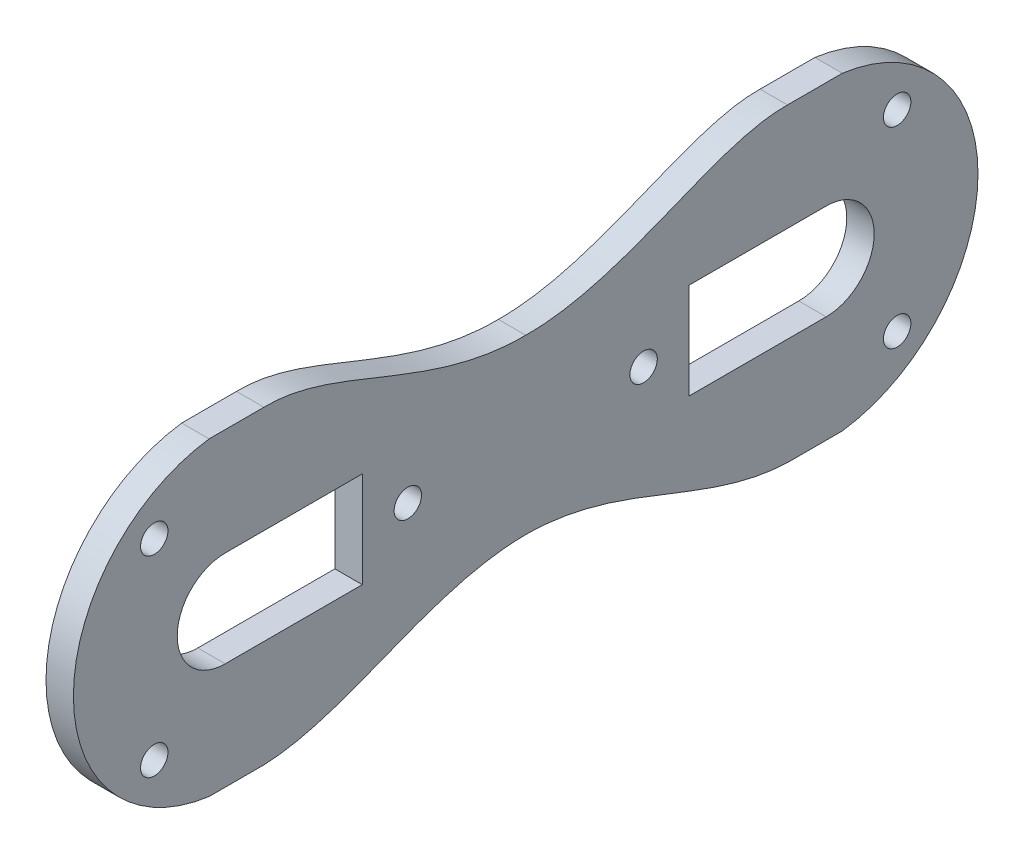
ISO-10303-21;
HEADER;
FILE_DESCRIPTION(('STEP AP214'),'2;1');
FILE_NAME('part.step','',(''),(''),'','','');
FILE_SCHEMA(('AUTOMOTIVE_DESIGN { 1 0 10303 214 1 1 1 1 }'));
ENDSEC;
DATA;
#1=APPLICATION_CONTEXT('core data for automotive mechanical design processes');
#2=APPLICATION_PROTOCOL_DEFINITION('international standard','automotive_design',2000,#1);
#3=PRODUCT_CONTEXT('',#1,'mechanical');
#4=PRODUCT('Part','Part','',(#3));
#5=PRODUCT_RELATED_PRODUCT_CATEGORY('part','',(#4));
#6=PRODUCT_DEFINITION_FORMATION('','',#4);
#7=PRODUCT_DEFINITION_CONTEXT('part definition',#1,'design');
#8=PRODUCT_DEFINITION('design','',#6,#7);
#9=PRODUCT_DEFINITION_SHAPE('','',#8);
#10=(LENGTH_UNIT() NAMED_UNIT(*) SI_UNIT(.MILLI.,.METRE.));
#11=(NAMED_UNIT(*) PLANE_ANGLE_UNIT() SI_UNIT($,.RADIAN.));
#12=(NAMED_UNIT(*) SI_UNIT($,.STERADIAN.) SOLID_ANGLE_UNIT());
#13=UNCERTAINTY_MEASURE_WITH_UNIT(LENGTH_MEASURE(1.E-05),#10,'distance_accuracy_value','');
#14=(GEOMETRIC_REPRESENTATION_CONTEXT(3) GLOBAL_UNCERTAINTY_ASSIGNED_CONTEXT((#13)) GLOBAL_UNIT_ASSIGNED_CONTEXT((#10,
#11,#12)) REPRESENTATION_CONTEXT('',''));
#15=CARTESIAN_POINT('',(0.,0.,0.));
#16=DIRECTION('',(0.,0.,1.));
#17=DIRECTION('',(1.,0.,0.));
#18=AXIS2_PLACEMENT_3D('',#15,#16,#17);
#19=CARTESIAN_POINT('',(2.,-3.5,0.));
#20=DIRECTION('',(0.,1.,0.));
#21=DIRECTION('',(0.,0.,1.));
#22=AXIS2_PLACEMENT_3D('',#19,#20,#21);
#23=PLANE('',#22);
#24=DIRECTION('',(0.,0.,-1.));
#25=VECTOR('',#24,1.);
#26=CARTESIAN_POINT('',(0.,-3.5,0.));
#27=LINE('',#26,#25);
#28=CARTESIAN_POINT('',(0.,-3.5,9.6760101010101));
#29=VERTEX_POINT('',#28);
#30=CARTESIAN_POINT('',(0.,-3.5,-0.323989898989895));
#31=VERTEX_POINT('',#30);
#32=EDGE_CURVE('E277',#29,#31,#27,.T.);
#33=ORIENTED_EDGE('',*,*,#32,.F.);
#34=DIRECTION('',(-1.,0.,0.));
#35=VECTOR('',#34,1.);
#36=CARTESIAN_POINT('',(2.,-3.5,9.6760101010101));
#37=LINE('',#36,#35);
#38=CARTESIAN_POINT('',(2.,-3.5,9.6760101010101));
#39=VERTEX_POINT('',#38);
#40=EDGE_CURVE('E11',#39,#29,#37,.T.);
#41=ORIENTED_EDGE('',*,*,#40,.F.);
#42=DIRECTION('',(0.,0.,-1.));
#43=VECTOR('',#42,1.);
#44=CARTESIAN_POINT('',(2.,-3.5,0.));
#45=LINE('',#44,#43);
#46=CARTESIAN_POINT('',(2.,-3.5,-0.323989898989895));
#47=VERTEX_POINT('',#46);
#48=EDGE_CURVE('E189',#39,#47,#45,.T.);
#49=ORIENTED_EDGE('',*,*,#48,.T.);
#50=DIRECTION('',(-1.,0.,0.));
#51=VECTOR('',#50,1.);
#52=CARTESIAN_POINT('',(2.,-3.5,-0.323989898989895));
#53=LINE('',#52,#51);
#54=EDGE_CURVE('E119',#47,#31,#53,.T.);
#55=ORIENTED_EDGE('',*,*,#54,.T.);
#56=EDGE_LOOP('',(#33,#41,#49,#55));
#57=FACE_BOUND('',#56,.T.);
#58=ADVANCED_FACE('F35',(#57),#23,.T.);
#59=CARTESIAN_POINT('',(2.,0.,9.6760101010101));
#60=DIRECTION('',(0.,0.,-1.));
#61=DIRECTION('',(-1.,0.,0.));
#62=AXIS2_PLACEMENT_3D('',#59,#60,#61);
#63=PLANE('',#62);
#64=DIRECTION('',(0.,-1.,0.));
#65=VECTOR('',#64,1.);
#66=CARTESIAN_POINT('',(0.,0.,9.6760101010101));
#67=LINE('',#66,#65);
#68=CARTESIAN_POINT('',(0.,3.5,9.6760101010101));
#69=VERTEX_POINT('',#68);
#70=EDGE_CURVE('E178',#69,#29,#67,.T.);
#71=ORIENTED_EDGE('',*,*,#70,.F.);
#72=DIRECTION('',(-1.,0.,0.));
#73=VECTOR('',#72,1.);
#74=CARTESIAN_POINT('',(2.,3.5,9.6760101010101));
#75=LINE('',#74,#73);
#76=CARTESIAN_POINT('',(2.,3.5,9.6760101010101));
#77=VERTEX_POINT('',#76);
#78=EDGE_CURVE('E45',#77,#69,#75,.T.);
#79=ORIENTED_EDGE('',*,*,#78,.F.);
#80=DIRECTION('',(0.,-1.,0.));
#81=VECTOR('',#80,1.);
#82=CARTESIAN_POINT('',(2.,0.,9.6760101010101));
#83=LINE('',#82,#81);
#84=EDGE_CURVE('E176',#77,#39,#83,.T.);
#85=ORIENTED_EDGE('',*,*,#84,.T.);
#86=ORIENTED_EDGE('',*,*,#40,.T.);
#87=EDGE_LOOP('',(#71,#79,#85,#86));
#88=FACE_BOUND('',#87,.T.);
#89=ADVANCED_FACE('F174',(#88),#63,.T.);
#90=CARTESIAN_POINT('',(2.,3.5,0.));
#91=DIRECTION('',(0.,1.,0.));
#92=DIRECTION('',(0.,0.,1.));
#93=AXIS2_PLACEMENT_3D('',#90,#91,#92);
#94=PLANE('',#93);
#95=DIRECTION('',(0.,0.,-1.));
#96=VECTOR('',#95,1.);
#97=CARTESIAN_POINT('',(0.,3.5,0.));
#98=LINE('',#97,#96);
#99=CARTESIAN_POINT('',(0.,3.5,-0.323989898989895));
#100=VERTEX_POINT('',#99);
#101=EDGE_CURVE('E280',#69,#100,#98,.T.);
#102=ORIENTED_EDGE('',*,*,#101,.T.);
#103=DIRECTION('',(-1.,0.,0.));
#104=VECTOR('',#103,1.);
#105=CARTESIAN_POINT('',(2.,3.5,-0.323989898989895));
#106=LINE('',#105,#104);
#107=CARTESIAN_POINT('',(2.,3.5,-0.323989898989895));
#108=VERTEX_POINT('',#107);
#109=EDGE_CURVE('E181',#108,#100,#106,.T.);
#110=ORIENTED_EDGE('',*,*,#109,.F.);
#111=DIRECTION('',(0.,0.,-1.));
#112=VECTOR('',#111,1.);
#113=CARTESIAN_POINT('',(2.,3.5,0.));
#114=LINE('',#113,#112);
#115=EDGE_CURVE('E184',#77,#108,#114,.T.);
#116=ORIENTED_EDGE('',*,*,#115,.F.);
#117=ORIENTED_EDGE('',*,*,#78,.T.);
#118=EDGE_LOOP('',(#102,#110,#116,#117));
#119=FACE_BOUND('',#118,.T.);
#120=ADVANCED_FACE('F185',(#119),#94,.F.);
#121=CARTESIAN_POINT('',(2.,3.5,0.));
#122=DIRECTION('',(0.,-1.,0.));
#123=DIRECTION('',(0.,0.,-1.));
#124=AXIS2_PLACEMENT_3D('',#121,#122,#123);
#125=PLANE('',#124);
#126=DIRECTION('',(0.,0.,1.));
#127=VECTOR('',#126,1.);
#128=CARTESIAN_POINT('',(0.,3.5,0.));
#129=LINE('',#128,#127);
#130=CARTESIAN_POINT('',(0.,3.5,33.5260101010101));
#131=VERTEX_POINT('',#130);
#132=CARTESIAN_POINT('',(0.,3.5,43.5260101010101));
#133=VERTEX_POINT('',#132);
#134=EDGE_CURVE('E256',#131,#133,#129,.T.);
#135=ORIENTED_EDGE('',*,*,#134,.F.);
#136=DIRECTION('',(-1.,0.,0.));
#137=VECTOR('',#136,1.);
#138=CARTESIAN_POINT('',(2.,3.5,33.5260101010101));
#139=LINE('',#138,#137);
#140=CARTESIAN_POINT('',(2.,3.5,33.5260101010101));
#141=VERTEX_POINT('',#140);
#142=EDGE_CURVE('E291',#141,#131,#139,.T.);
#143=ORIENTED_EDGE('',*,*,#142,.F.);
#144=DIRECTION('',(0.,0.,1.));
#145=VECTOR('',#144,1.);
#146=CARTESIAN_POINT('',(2.,3.5,0.));
#147=LINE('',#146,#145);
#148=CARTESIAN_POINT('',(2.,3.5,43.5260101010101));
#149=VERTEX_POINT('',#148);
#150=EDGE_CURVE('E446',#141,#149,#147,.T.);
#151=ORIENTED_EDGE('',*,*,#150,.T.);
#152=DIRECTION('',(-1.,0.,0.));
#153=VECTOR('',#152,1.);
#154=CARTESIAN_POINT('',(2.,3.5,43.5260101010101));
#155=LINE('',#154,#153);
#156=EDGE_CURVE('E293',#149,#133,#155,.T.);
#157=ORIENTED_EDGE('',*,*,#156,.T.);
#158=EDGE_LOOP('',(#135,#143,#151,#157));
#159=FACE_BOUND('',#158,.T.);
#160=ADVANCED_FACE('F409',(#159),#125,.T.);
#161=CARTESIAN_POINT('',(2.,0.,33.5260101010101));
#162=DIRECTION('',(0.,0.,-1.));
#163=DIRECTION('',(-1.,0.,0.));
#164=AXIS2_PLACEMENT_3D('',#161,#162,#163);
#165=PLANE('',#164);
#166=DIRECTION('',(0.,-1.,0.));
#167=VECTOR('',#166,1.);
#168=CARTESIAN_POINT('',(0.,0.,33.5260101010101));
#169=LINE('',#168,#167);
#170=CARTESIAN_POINT('',(0.,-3.5,33.5260101010101));
#171=VERTEX_POINT('',#170);
#172=EDGE_CURVE('E259',#131,#171,#169,.T.);
#173=ORIENTED_EDGE('',*,*,#172,.T.);
#174=DIRECTION('',(-1.,0.,0.));
#175=VECTOR('',#174,1.);
#176=CARTESIAN_POINT('',(2.,-3.5,33.5260101010101));
#177=LINE('',#176,#175);
#178=CARTESIAN_POINT('',(2.,-3.5,33.5260101010101));
#179=VERTEX_POINT('',#178);
#180=EDGE_CURVE('E297',#179,#171,#177,.T.);
#181=ORIENTED_EDGE('',*,*,#180,.F.);
#182=DIRECTION('',(0.,-1.,0.));
#183=VECTOR('',#182,1.);
#184=CARTESIAN_POINT('',(2.,0.,33.5260101010101));
#185=LINE('',#184,#183);
#186=EDGE_CURVE('E449',#141,#179,#185,.T.);
#187=ORIENTED_EDGE('',*,*,#186,.F.);
#188=ORIENTED_EDGE('',*,*,#142,.T.);
#189=EDGE_LOOP('',(#173,#181,#187,#188));
#190=FACE_BOUND('',#189,.T.);
#191=ADVANCED_FACE('F405',(#190),#165,.F.);
#192=CARTESIAN_POINT('',(2.,-3.5,0.));
#193=DIRECTION('',(0.,-1.,0.));
#194=DIRECTION('',(0.,0.,-1.));
#195=AXIS2_PLACEMENT_3D('',#192,#193,#194);
#196=PLANE('',#195);
#197=DIRECTION('',(0.,0.,1.));
#198=VECTOR('',#197,1.);
#199=CARTESIAN_POINT('',(0.,-3.5,0.));
#200=LINE('',#199,#198);
#201=CARTESIAN_POINT('',(0.,-3.5,43.5260101010101));
#202=VERTEX_POINT('',#201);
#203=EDGE_CURVE('E262',#171,#202,#200,.T.);
#204=ORIENTED_EDGE('',*,*,#203,.T.);
#205=DIRECTION('',(-1.,0.,0.));
#206=VECTOR('',#205,1.);
#207=CARTESIAN_POINT('',(2.,-3.5,43.5260101010101));
#208=LINE('',#207,#206);
#209=CARTESIAN_POINT('',(2.,-3.5,43.5260101010101));
#210=VERTEX_POINT('',#209);
#211=EDGE_CURVE('E295',#210,#202,#208,.T.);
#212=ORIENTED_EDGE('',*,*,#211,.F.);
#213=DIRECTION('',(0.,0.,1.));
#214=VECTOR('',#213,1.);
#215=CARTESIAN_POINT('',(2.,-3.5,0.));
#216=LINE('',#215,#214);
#217=EDGE_CURVE('E452',#179,#210,#216,.T.);
#218=ORIENTED_EDGE('',*,*,#217,.F.);
#219=ORIENTED_EDGE('',*,*,#180,.T.);
#220=EDGE_LOOP('',(#204,#212,#218,#219));
#221=FACE_BOUND('',#220,.T.);
#222=ADVANCED_FACE('F402',(#221),#196,.F.);
#223=CARTESIAN_POINT('',(2.,11.3,0.));
#224=DIRECTION('',(0.,-1.,0.));
#225=DIRECTION('',(0.,0.,-1.));
#226=AXIS2_PLACEMENT_3D('',#223,#224,#225);
#227=PLANE('',#226);
#228=DIRECTION('',(0.,0.,1.));
#229=VECTOR('',#228,1.);
#230=CARTESIAN_POINT('',(0.,11.3,0.));
#231=LINE('',#230,#229);
#232=CARTESIAN_POINT('',(0.,11.3,-1.49898989898991));
#233=VERTEX_POINT('',#232);
#234=CARTESIAN_POINT('',(0.,11.3,2.50101010101009));
#235=VERTEX_POINT('',#234);
#236=EDGE_CURVE('E203',#233,#235,#231,.T.);
#237=ORIENTED_EDGE('',*,*,#236,.T.);
#238=DIRECTION('',(-1.,0.,0.));
#239=VECTOR('',#238,1.);
#240=CARTESIAN_POINT('',(2.,11.3,2.50101010101009));
#241=LINE('',#240,#239);
#242=CARTESIAN_POINT('',(2.,11.3,2.50101010101009));
#243=VERTEX_POINT('',#242);
#244=EDGE_CURVE('E39',#243,#235,#241,.T.);
#245=ORIENTED_EDGE('',*,*,#244,.F.);
#246=DIRECTION('',(0.,0.,1.));
#247=VECTOR('',#246,1.);
#248=CARTESIAN_POINT('',(2.,11.3,0.));
#249=LINE('',#248,#247);
#250=CARTESIAN_POINT('',(2.,11.3,-1.49898989898991));
#251=VERTEX_POINT('',#250);
#252=EDGE_CURVE('E289',#251,#243,#249,.T.);
#253=ORIENTED_EDGE('',*,*,#252,.F.);
#254=DIRECTION('',(-1.,0.,0.));
#255=VECTOR('',#254,1.);
#256=CARTESIAN_POINT('',(2.,11.3,-1.49898989898991));
#257=LINE('',#256,#255);
#258=EDGE_CURVE('E202',#251,#233,#257,.T.);
#259=ORIENTED_EDGE('',*,*,#258,.T.);
#260=EDGE_LOOP('',(#237,#245,#253,#259));
#261=FACE_BOUND('',#260,.T.);
#262=ADVANCED_FACE('F37',(#261),#227,.F.);
#263=CARTESIAN_POINT('',(2.,11.3,2.50101010101009));
#264=CARTESIAN_POINT('',(2.,11.4296100531924,7.83989895120709));
#265=CARTESIAN_POINT('',(2.,6.2166526259407,14.3517891795841));
#266=CARTESIAN_POINT('',(2.,6.3,21.6010101010101));
#267=B_SPLINE_CURVE_WITH_KNOTS('',3,(#263,#264,#265,#266),.UNSPECIFIED.,.F.,.F.,(4,4),(0.,1.),.UNSPECIFIED.);
#268=DIRECTION('',(-1.,0.,0.));
#269=VECTOR('',#268,1.);
#270=SURFACE_OF_LINEAR_EXTRUSION('',#267,#269);
#271=CARTESIAN_POINT('',(0.,11.3,2.50101010101009));
#272=CARTESIAN_POINT('',(0.,11.4296100531924,7.83989895120709));
#273=CARTESIAN_POINT('',(0.,6.2166526259407,14.3517891795841));
#274=CARTESIAN_POINT('',(0.,6.3,21.6010101010101));
#275=B_SPLINE_CURVE_WITH_KNOTS('',3,(#271,#272,#273,#274),.UNSPECIFIED.,.F.,.F.,(4,4),(0.,1.),.UNSPECIFIED.);
#276=CARTESIAN_POINT('',(0.,6.3,21.6010101010101));
#277=VERTEX_POINT('',#276);
#278=EDGE_CURVE('E206',#235,#277,#275,.T.);
#279=ORIENTED_EDGE('',*,*,#278,.T.);
#280=DIRECTION('',(-1.,0.,0.));
#281=VECTOR('',#280,1.);
#282=CARTESIAN_POINT('',(2.,6.3,21.6010101010101));
#283=LINE('',#282,#281);
#284=CARTESIAN_POINT('',(2.,6.3,21.6010101010101));
#285=VERTEX_POINT('',#284);
#286=EDGE_CURVE('E315',#285,#277,#283,.T.);
#287=ORIENTED_EDGE('',*,*,#286,.F.);
#288=EDGE_CURVE('E127',#243,#285,#267,.T.);
#289=ORIENTED_EDGE('',*,*,#288,.F.);
#290=ORIENTED_EDGE('',*,*,#244,.T.);
#291=EDGE_LOOP('',(#279,#287,#289,#290));
#292=FACE_BOUND('',#291,.T.);
#293=ADVANCED_FACE('F320',(#292),#270,.F.);
#294=CARTESIAN_POINT('',(2.,11.3,40.7010101010101));
#295=CARTESIAN_POINT('',(2.,11.4296100531924,35.3621212508131));
#296=CARTESIAN_POINT('',(2.,6.2166526259407,28.8502310224361));
#297=CARTESIAN_POINT('',(2.,6.3,21.6010101010101));
#298=B_SPLINE_CURVE_WITH_KNOTS('',3,(#294,#295,#296,#297),.UNSPECIFIED.,.F.,.F.,(4,4),(0.,1.),.UNSPECIFIED.);
#299=DIRECTION('',(-1.,0.,0.));
#300=VECTOR('',#299,1.);
#301=SURFACE_OF_LINEAR_EXTRUSION('',#298,#300);
#302=CARTESIAN_POINT('',(0.,11.3,40.7010101010101));
#303=CARTESIAN_POINT('',(0.,11.4296100531924,35.3621212508131));
#304=CARTESIAN_POINT('',(0.,6.2166526259407,28.8502310224361));
#305=CARTESIAN_POINT('',(0.,6.3,21.6010101010101));
#306=B_SPLINE_CURVE_WITH_KNOTS('',3,(#302,#303,#304,#305),.UNSPECIFIED.,.F.,.F.,(4,4),(0.,1.),.UNSPECIFIED.);
#307=CARTESIAN_POINT('',(0.,11.3,40.7010101010101));
#308=VERTEX_POINT('',#307);
#309=EDGE_CURVE('E211',#308,#277,#306,.T.);
#310=ORIENTED_EDGE('',*,*,#309,.F.);
#311=DIRECTION('',(-1.,0.,0.));
#312=VECTOR('',#311,1.);
#313=CARTESIAN_POINT('',(2.,11.3,40.7010101010101));
#314=LINE('',#313,#312);
#315=CARTESIAN_POINT('',(2.,11.3,40.7010101010101));
#316=VERTEX_POINT('',#315);
#317=EDGE_CURVE('E314',#316,#308,#314,.T.);
#318=ORIENTED_EDGE('',*,*,#317,.F.);
#319=EDGE_CURVE('E728',#316,#285,#298,.T.);
#320=ORIENTED_EDGE('',*,*,#319,.T.);
#321=ORIENTED_EDGE('',*,*,#286,.T.);
#322=EDGE_LOOP('',(#310,#318,#320,#321));
#323=FACE_BOUND('',#322,.T.);
#324=ADVANCED_FACE('F367',(#323),#301,.T.);
#325=CARTESIAN_POINT('',(2.,11.3,0.));
#326=DIRECTION('',(0.,1.,0.));
#327=DIRECTION('',(0.,0.,1.));
#328=AXIS2_PLACEMENT_3D('',#325,#326,#327);
#329=PLANE('',#328);
#330=DIRECTION('',(0.,0.,-1.));
#331=VECTOR('',#330,1.);
#332=CARTESIAN_POINT('',(0.,11.3,0.));
#333=LINE('',#332,#331);
#334=CARTESIAN_POINT('',(0.,11.3,44.7010101010101));
#335=VERTEX_POINT('',#334);
#336=EDGE_CURVE('E219',#335,#308,#333,.T.);
#337=ORIENTED_EDGE('',*,*,#336,.F.);
#338=DIRECTION('',(-1.,0.,0.));
#339=VECTOR('',#338,1.);
#340=CARTESIAN_POINT('',(2.,11.3,44.7010101010101));
#341=LINE('',#340,#339);
#342=CARTESIAN_POINT('',(2.,11.3,44.7010101010101));
#343=VERTEX_POINT('',#342);
#344=EDGE_CURVE('E312',#343,#335,#341,.T.);
#345=ORIENTED_EDGE('',*,*,#344,.F.);
#346=DIRECTION('',(0.,0.,-1.));
#347=VECTOR('',#346,1.);
#348=CARTESIAN_POINT('',(2.,11.3,0.));
#349=LINE('',#348,#347);
#350=EDGE_CURVE('E365',#343,#316,#349,.T.);
#351=ORIENTED_EDGE('',*,*,#350,.T.);
#352=ORIENTED_EDGE('',*,*,#317,.T.);
#353=EDGE_LOOP('',(#337,#345,#351,#352));
#354=FACE_BOUND('',#353,.T.);
#355=ADVANCED_FACE('F362',(#354),#329,.T.);
#356=CARTESIAN_POINT('',(2.,0.,43.2020202020202));
#357=DIRECTION('',(-1.,0.,0.));
#358=DIRECTION('',(0.,0.,1.));
#359=AXIS2_PLACEMENT_3D('',#356,#357,#358);
#360=CYLINDRICAL_SURFACE('',#359,11.3989898989899);
#361=CARTESIAN_POINT('',(0.,0.,43.2020202020202));
#362=DIRECTION('',(1.,0.,0.));
#363=DIRECTION('',(0.,0.,-1.));
#364=AXIS2_PLACEMENT_3D('',#361,#362,#363);
#365=CIRCLE('',#364,11.3989898989899);
#366=CARTESIAN_POINT('',(0.,-11.3,44.7010101010101));
#367=VERTEX_POINT('',#366);
#368=EDGE_CURVE('E225',#335,#367,#365,.T.);
#369=ORIENTED_EDGE('',*,*,#368,.T.);
#370=DIRECTION('',(-1.,0.,0.));
#371=VECTOR('',#370,1.);
#372=CARTESIAN_POINT('',(2.,-11.3,44.7010101010101));
#373=LINE('',#372,#371);
#374=CARTESIAN_POINT('',(2.,-11.3,44.7010101010101));
#375=VERTEX_POINT('',#374);
#376=EDGE_CURVE('E310',#375,#367,#373,.T.);
#377=ORIENTED_EDGE('',*,*,#376,.F.);
#378=CARTESIAN_POINT('',(2.,0.,43.2020202020202));
#379=DIRECTION('',(1.,0.,0.));
#380=DIRECTION('',(0.,0.,-1.));
#381=AXIS2_PLACEMENT_3D('',#378,#379,#380);
#382=CIRCLE('',#381,11.3989898989899);
#383=EDGE_CURVE('E744',#343,#375,#382,.T.);
#384=ORIENTED_EDGE('',*,*,#383,.F.);
#385=ORIENTED_EDGE('',*,*,#344,.T.);
#386=EDGE_LOOP('',(#369,#377,#384,#385));
#387=FACE_BOUND('',#386,.T.);
#388=ADVANCED_FACE('F359',(#387),#360,.T.);
#389=CARTESIAN_POINT('',(2.,-11.3,0.));
#390=DIRECTION('',(0.,-1.,0.));
#391=DIRECTION('',(0.,0.,-1.));
#392=AXIS2_PLACEMENT_3D('',#389,#390,#391);
#393=PLANE('',#392);
#394=DIRECTION('',(0.,0.,1.));
#395=VECTOR('',#394,1.);
#396=CARTESIAN_POINT('',(0.,-11.3,0.));
#397=LINE('',#396,#395);
#398=CARTESIAN_POINT('',(0.,-11.3,40.7010101010101));
#399=VERTEX_POINT('',#398);
#400=EDGE_CURVE('E228',#399,#367,#397,.T.);
#401=ORIENTED_EDGE('',*,*,#400,.F.);
#402=DIRECTION('',(-1.,0.,0.));
#403=VECTOR('',#402,1.);
#404=CARTESIAN_POINT('',(2.,-11.3,40.7010101010101));
#405=LINE('',#404,#403);
#406=CARTESIAN_POINT('',(2.,-11.3,40.7010101010101));
#407=VERTEX_POINT('',#406);
#408=EDGE_CURVE('E308',#407,#399,#405,.T.);
#409=ORIENTED_EDGE('',*,*,#408,.F.);
#410=DIRECTION('',(0.,0.,1.));
#411=VECTOR('',#410,1.);
#412=CARTESIAN_POINT('',(2.,-11.3,0.));
#413=LINE('',#412,#411);
#414=EDGE_CURVE('E356',#407,#375,#413,.T.);
#415=ORIENTED_EDGE('',*,*,#414,.T.);
#416=ORIENTED_EDGE('',*,*,#376,.T.);
#417=EDGE_LOOP('',(#401,#409,#415,#416));
#418=FACE_BOUND('',#417,.T.);
#419=ADVANCED_FACE('F352',(#418),#393,.T.);
#420=CARTESIAN_POINT('',(2.,-11.3,40.7010101010101));
#421=CARTESIAN_POINT('',(2.,-11.0635846151513,34.4557796350953));
#422=CARTESIAN_POINT('',(2.,-6.33994929020768,28.7693606156067));
#423=CARTESIAN_POINT('',(2.,-6.29999999999999,21.6010101010101));
#424=B_SPLINE_CURVE_WITH_KNOTS('',3,(#420,#421,#422,#423),.UNSPECIFIED.,.F.,.F.,(4,4),(0.,1.),.UNSPECIFIED.);
#425=DIRECTION('',(-1.,0.,0.));
#426=VECTOR('',#425,1.);
#427=SURFACE_OF_LINEAR_EXTRUSION('',#424,#426);
#428=CARTESIAN_POINT('',(0.,-11.3,40.7010101010101));
#429=CARTESIAN_POINT('',(0.,-11.0635846151513,34.4557796350953));
#430=CARTESIAN_POINT('',(0.,-6.33994929020768,28.7693606156067));
#431=CARTESIAN_POINT('',(0.,-6.29999999999999,21.6010101010101));
#432=B_SPLINE_CURVE_WITH_KNOTS('',3,(#428,#429,#430,#431),.UNSPECIFIED.,.F.,.F.,(4,4),(0.,1.),.UNSPECIFIED.);
#433=CARTESIAN_POINT('',(0.,-6.29999999999999,21.6010101010101));
#434=VERTEX_POINT('',#433);
#435=EDGE_CURVE('E231',#399,#434,#432,.T.);
#436=ORIENTED_EDGE('',*,*,#435,.T.);
#437=DIRECTION('',(-1.,0.,0.));
#438=VECTOR('',#437,1.);
#439=CARTESIAN_POINT('',(2.,-6.29999999999999,21.6010101010101));
#440=LINE('',#439,#438);
#441=CARTESIAN_POINT('',(2.,-6.29999999999999,21.6010101010101));
#442=VERTEX_POINT('',#441);
#443=EDGE_CURVE('E306',#442,#434,#440,.T.);
#444=ORIENTED_EDGE('',*,*,#443,.F.);
#445=EDGE_CURVE('E433',#407,#442,#424,.T.);
#446=ORIENTED_EDGE('',*,*,#445,.F.);
#447=ORIENTED_EDGE('',*,*,#408,.T.);
#448=EDGE_LOOP('',(#436,#444,#446,#447));
#449=FACE_BOUND('',#448,.T.);
#450=ADVANCED_FACE('F348',(#449),#427,.F.);
#451=CARTESIAN_POINT('',(2.,-11.3,2.50101010101009));
#452=CARTESIAN_POINT('',(2.,-11.0635846151513,8.74624056692493));
#453=CARTESIAN_POINT('',(2.,-6.33994929020768,14.4326595864135));
#454=CARTESIAN_POINT('',(2.,-6.29999999999999,21.6010101010101));
#455=B_SPLINE_CURVE_WITH_KNOTS('',3,(#451,#452,#453,#454),.UNSPECIFIED.,.F.,.F.,(4,4),(0.,1.),.UNSPECIFIED.);
#456=DIRECTION('',(-1.,0.,0.));
#457=VECTOR('',#456,1.);
#458=SURFACE_OF_LINEAR_EXTRUSION('',#455,#457);
#459=CARTESIAN_POINT('',(0.,-11.3,2.50101010101009));
#460=CARTESIAN_POINT('',(0.,-11.0635846151513,8.74624056692493));
#461=CARTESIAN_POINT('',(0.,-6.33994929020768,14.4326595864135));
#462=CARTESIAN_POINT('',(0.,-6.29999999999999,21.6010101010101));
#463=B_SPLINE_CURVE_WITH_KNOTS('',3,(#459,#460,#461,#462),.UNSPECIFIED.,.F.,.F.,(4,4),(0.,1.),.UNSPECIFIED.);
#464=CARTESIAN_POINT('',(0.,-11.3,2.50101010101009));
#465=VERTEX_POINT('',#464);
#466=EDGE_CURVE('E236',#465,#434,#463,.T.);
#467=ORIENTED_EDGE('',*,*,#466,.F.);
#468=DIRECTION('',(-1.,0.,0.));
#469=VECTOR('',#468,1.);
#470=CARTESIAN_POINT('',(2.,-11.3,2.50101010101009));
#471=LINE('',#470,#469);
#472=CARTESIAN_POINT('',(2.,-11.3,2.50101010101009));
#473=VERTEX_POINT('',#472);
#474=EDGE_CURVE('E304',#473,#465,#471,.T.);
#475=ORIENTED_EDGE('',*,*,#474,.F.);
#476=EDGE_CURVE('E345',#473,#442,#455,.T.);
#477=ORIENTED_EDGE('',*,*,#476,.T.);
#478=ORIENTED_EDGE('',*,*,#443,.T.);
#479=EDGE_LOOP('',(#467,#475,#477,#478));
#480=FACE_BOUND('',#479,.T.);
#481=ADVANCED_FACE('F341',(#480),#458,.T.);
#482=CARTESIAN_POINT('',(2.,-11.3,0.));
#483=DIRECTION('',(0.,1.,0.));
#484=DIRECTION('',(0.,0.,1.));
#485=AXIS2_PLACEMENT_3D('',#482,#483,#484);
#486=PLANE('',#485);
#487=DIRECTION('',(0.,0.,-1.));
#488=VECTOR('',#487,1.);
#489=CARTESIAN_POINT('',(0.,-11.3,0.));
#490=LINE('',#489,#488);
#491=CARTESIAN_POINT('',(0.,-11.3,-1.49898989898991));
#492=VERTEX_POINT('',#491);
#493=EDGE_CURVE('E244',#465,#492,#490,.T.);
#494=ORIENTED_EDGE('',*,*,#493,.T.);
#495=DIRECTION('',(-1.,0.,0.));
#496=VECTOR('',#495,1.);
#497=CARTESIAN_POINT('',(2.,-11.3,-1.49898989898991));
#498=LINE('',#497,#496);
#499=CARTESIAN_POINT('',(2.,-11.3,-1.49898989898991));
#500=VERTEX_POINT('',#499);
#501=EDGE_CURVE('E302',#500,#492,#498,.T.);
#502=ORIENTED_EDGE('',*,*,#501,.F.);
#503=DIRECTION('',(0.,0.,-1.));
#504=VECTOR('',#503,1.);
#505=CARTESIAN_POINT('',(2.,-11.3,0.));
#506=LINE('',#505,#504);
#507=EDGE_CURVE('E432',#473,#500,#506,.T.);
#508=ORIENTED_EDGE('',*,*,#507,.F.);
#509=ORIENTED_EDGE('',*,*,#474,.T.);
#510=EDGE_LOOP('',(#494,#502,#508,#509));
#511=FACE_BOUND('',#510,.T.);
#512=ADVANCED_FACE('F337',(#511),#486,.F.);
#513=CARTESIAN_POINT('',(2.,-7.,-5.5));
#514=DIRECTION('',(-1.,0.,0.));
#515=DIRECTION('',(0.,0.,1.));
#516=AXIS2_PLACEMENT_3D('',#513,#514,#515);
#517=CYLINDRICAL_SURFACE('',#516,1.);
#518=CARTESIAN_POINT('',(2.,-7.,-5.5));
#519=DIRECTION('',(1.,0.,0.));
#520=DIRECTION('',(0.,0.,-1.));
#521=AXIS2_PLACEMENT_3D('',#518,#519,#520);
#522=CIRCLE('',#521,1.);
#523=CARTESIAN_POINT('',(2.,-7.,-6.5));
#524=VERTEX_POINT('',#523);
#525=EDGE_CURVE('E196',#524,#524,#522,.T.);
#526=ORIENTED_EDGE('',*,*,#525,.T.);
#527=EDGE_LOOP('',(#526));
#528=FACE_BOUND('',#527,.T.);
#529=CARTESIAN_POINT('',(0.,-7.,-5.5));
#530=DIRECTION('',(1.,0.,0.));
#531=DIRECTION('',(0.,0.,-1.));
#532=AXIS2_PLACEMENT_3D('',#529,#530,#531);
#533=CIRCLE('',#532,1.);
#534=CARTESIAN_POINT('',(0.,-7.,-6.5));
#535=VERTEX_POINT('',#534);
#536=EDGE_CURVE('E283',#535,#535,#533,.T.);
#537=ORIENTED_EDGE('',*,*,#536,.F.);
#538=EDGE_LOOP('',(#537));
#539=FACE_BOUND('',#538,.T.);
#540=ADVANCED_FACE('F422',(#528,#539),#517,.F.);
#541=CARTESIAN_POINT('',(2.,0.,-0.323989898989895));
#542=DIRECTION('',(-1.,0.,0.));
#543=DIRECTION('',(0.,0.,1.));
#544=AXIS2_PLACEMENT_3D('',#541,#542,#543);
#545=CYLINDRICAL_SURFACE('',#544,3.5);
#546=CARTESIAN_POINT('',(0.,0.,-0.323989898989895));
#547=DIRECTION('',(1.,0.,0.));
#548=DIRECTION('',(0.,0.,-1.));
#549=AXIS2_PLACEMENT_3D('',#546,#547,#548);
#550=CIRCLE('',#549,3.5);
#551=EDGE_CURVE('E112',#100,#31,#550,.F.);
#552=ORIENTED_EDGE('',*,*,#551,.T.);
#553=ORIENTED_EDGE('',*,*,#54,.F.);
#554=CARTESIAN_POINT('',(2.,0.,-0.323989898989895));
#555=DIRECTION('',(1.,0.,0.));
#556=DIRECTION('',(0.,0.,-1.));
#557=AXIS2_PLACEMENT_3D('',#554,#555,#556);
#558=CIRCLE('',#557,3.5);
#559=EDGE_CURVE('E54',#108,#47,#558,.F.);
#560=ORIENTED_EDGE('',*,*,#559,.F.);
#561=ORIENTED_EDGE('',*,*,#109,.T.);
#562=EDGE_LOOP('',(#552,#553,#560,#561));
#563=FACE_BOUND('',#562,.T.);
#564=ADVANCED_FACE('F388',(#563),#545,.F.);
#565=CARTESIAN_POINT('',(2.,0.,13.));
#566=DIRECTION('',(-1.,0.,0.));
#567=DIRECTION('',(0.,0.,1.));
#568=AXIS2_PLACEMENT_3D('',#565,#566,#567);
#569=CYLINDRICAL_SURFACE('',#568,1.);
#570=CARTESIAN_POINT('',(2.,0.,13.));
#571=DIRECTION('',(1.,0.,0.));
#572=DIRECTION('',(0.,0.,-1.));
#573=AXIS2_PLACEMENT_3D('',#570,#571,#572);
#574=CIRCLE('',#573,1.);
#575=CARTESIAN_POINT('',(2.,0.,12.));
#576=VERTEX_POINT('',#575);
#577=EDGE_CURVE('E191',#576,#576,#574,.T.);
#578=ORIENTED_EDGE('',*,*,#577,.T.);
#579=EDGE_LOOP('',(#578));
#580=FACE_BOUND('',#579,.T.);
#581=CARTESIAN_POINT('',(0.,0.,13.));
#582=DIRECTION('',(1.,0.,0.));
#583=DIRECTION('',(0.,0.,-1.));
#584=AXIS2_PLACEMENT_3D('',#581,#582,#583);
#585=CIRCLE('',#584,1.);
#586=CARTESIAN_POINT('',(0.,0.,12.));
#587=VERTEX_POINT('',#586);
#588=EDGE_CURVE('E274',#587,#587,#585,.T.);
#589=ORIENTED_EDGE('',*,*,#588,.F.);
#590=EDGE_LOOP('',(#589));
#591=FACE_BOUND('',#590,.T.);
#592=ADVANCED_FACE('F384',(#580,#591),#569,.F.);
#593=CARTESIAN_POINT('',(2.,7.,48.7020202020202));
#594=DIRECTION('',(-1.,0.,0.));
#595=DIRECTION('',(0.,0.,1.));
#596=AXIS2_PLACEMENT_3D('',#593,#594,#595);
#597=CYLINDRICAL_SURFACE('',#596,0.999999999999998);
#598=CARTESIAN_POINT('',(2.,7.,48.7020202020202));
#599=DIRECTION('',(1.,0.,0.));
#600=DIRECTION('',(0.,0.,-1.));
#601=AXIS2_PLACEMENT_3D('',#598,#599,#600);
#602=CIRCLE('',#601,0.999999999999998);
#603=CARTESIAN_POINT('',(2.,7.,47.7020202020202));
#604=VERTEX_POINT('',#603);
#605=EDGE_CURVE('E460',#604,#604,#602,.T.);
#606=ORIENTED_EDGE('',*,*,#605,.T.);
#607=EDGE_LOOP('',(#606));
#608=FACE_BOUND('',#607,.T.);
#609=CARTESIAN_POINT('',(0.,7.,48.7020202020202));
#610=DIRECTION('',(1.,0.,0.));
#611=DIRECTION('',(0.,0.,-1.));
#612=AXIS2_PLACEMENT_3D('',#609,#610,#611);
#613=CIRCLE('',#612,0.999999999999998);
#614=CARTESIAN_POINT('',(0.,7.,47.7020202020202));
#615=VERTEX_POINT('',#614);
#616=EDGE_CURVE('E271',#615,#615,#613,.T.);
#617=ORIENTED_EDGE('',*,*,#616,.F.);
#618=EDGE_LOOP('',(#617));
#619=FACE_BOUND('',#618,.T.);
#620=ADVANCED_FACE('F387',(#608,#619),#597,.F.);
#621=CARTESIAN_POINT('',(2.,-7.,48.7020202020202));
#622=DIRECTION('',(-1.,0.,0.));
#623=DIRECTION('',(0.,0.,1.));
#624=AXIS2_PLACEMENT_3D('',#621,#622,#623);
#625=CYLINDRICAL_SURFACE('',#624,0.999999999999998);
#626=CARTESIAN_POINT('',(2.,-7.,48.7020202020202));
#627=DIRECTION('',(1.,0.,0.));
#628=DIRECTION('',(0.,0.,-1.));
#629=AXIS2_PLACEMENT_3D('',#626,#627,#628);
#630=CIRCLE('',#629,0.999999999999998);
#631=CARTESIAN_POINT('',(2.,-7.,47.7020202020202));
#632=VERTEX_POINT('',#631);
#633=EDGE_CURVE('E457',#632,#632,#630,.T.);
#634=ORIENTED_EDGE('',*,*,#633,.T.);
#635=EDGE_LOOP('',(#634));
#636=FACE_BOUND('',#635,.T.);
#637=CARTESIAN_POINT('',(0.,-7.,48.7020202020202));
#638=DIRECTION('',(1.,0.,0.));
#639=DIRECTION('',(0.,0.,-1.));
#640=AXIS2_PLACEMENT_3D('',#637,#638,#639);
#641=CIRCLE('',#640,0.999999999999998);
#642=CARTESIAN_POINT('',(0.,-7.,47.7020202020202));
#643=VERTEX_POINT('',#642);
#644=EDGE_CURVE('E268',#643,#643,#641,.T.);
#645=ORIENTED_EDGE('',*,*,#644,.F.);
#646=EDGE_LOOP('',(#645));
#647=FACE_BOUND('',#646,.T.);
#648=ADVANCED_FACE('F392',(#636,#647),#625,.F.);
#649=CARTESIAN_POINT('',(2.,0.,43.5260101010101));
#650=DIRECTION('',(-1.,0.,0.));
#651=DIRECTION('',(0.,0.,1.));
#652=AXIS2_PLACEMENT_3D('',#649,#650,#651);
#653=CYLINDRICAL_SURFACE('',#652,3.5);
#654=CARTESIAN_POINT('',(0.,0.,43.5260101010101));
#655=DIRECTION('',(1.,0.,0.));
#656=DIRECTION('',(0.,0.,-1.));
#657=AXIS2_PLACEMENT_3D('',#654,#655,#656);
#658=CIRCLE('',#657,3.5);
#659=EDGE_CURVE('E265',#133,#202,#658,.T.);
#660=ORIENTED_EDGE('',*,*,#659,.F.);
#661=ORIENTED_EDGE('',*,*,#156,.F.);
#662=CARTESIAN_POINT('',(2.,0.,43.5260101010101));
#663=DIRECTION('',(1.,0.,0.));
#664=DIRECTION('',(0.,0.,-1.));
#665=AXIS2_PLACEMENT_3D('',#662,#663,#664);
#666=CIRCLE('',#665,3.5);
#667=EDGE_CURVE('E454',#149,#210,#666,.T.);
#668=ORIENTED_EDGE('',*,*,#667,.T.);
#669=ORIENTED_EDGE('',*,*,#211,.T.);
#670=EDGE_LOOP('',(#660,#661,#668,#669));
#671=FACE_BOUND('',#670,.T.);
#672=ADVANCED_FACE('F396',(#671),#653,.F.);
#673=CARTESIAN_POINT('',(2.,0.,30.2020202020202));
#674=DIRECTION('',(-1.,0.,0.));
#675=DIRECTION('',(0.,0.,1.));
#676=AXIS2_PLACEMENT_3D('',#673,#674,#675);
#677=CYLINDRICAL_SURFACE('',#676,0.999999999999998);
#678=CARTESIAN_POINT('',(2.,0.,30.2020202020202));
#679=DIRECTION('',(1.,0.,0.));
#680=DIRECTION('',(0.,0.,-1.));
#681=AXIS2_PLACEMENT_3D('',#678,#679,#680);
#682=CIRCLE('',#681,0.999999999999998);
#683=CARTESIAN_POINT('',(2.,0.,29.2020202020202));
#684=VERTEX_POINT('',#683);
#685=EDGE_CURVE('E443',#684,#684,#682,.T.);
#686=ORIENTED_EDGE('',*,*,#685,.T.);
#687=EDGE_LOOP('',(#686));
#688=FACE_BOUND('',#687,.T.);
#689=CARTESIAN_POINT('',(0.,0.,30.2020202020202));
#690=DIRECTION('',(1.,0.,0.));
#691=DIRECTION('',(0.,0.,-1.));
#692=AXIS2_PLACEMENT_3D('',#689,#690,#691);
#693=CIRCLE('',#692,0.999999999999998);
#694=CARTESIAN_POINT('',(0.,0.,29.2020202020202));
#695=VERTEX_POINT('',#694);
#696=EDGE_CURVE('E253',#695,#695,#693,.T.);
#697=ORIENTED_EDGE('',*,*,#696,.F.);
#698=EDGE_LOOP('',(#697));
#699=FACE_BOUND('',#698,.T.);
#700=ADVANCED_FACE('F400',(#688,#699),#677,.F.);
#701=CARTESIAN_POINT('',(2.,0.,0.));
#702=DIRECTION('',(-1.,0.,0.));
#703=DIRECTION('',(0.,0.,1.));
#704=AXIS2_PLACEMENT_3D('',#701,#702,#703);
#705=CYLINDRICAL_SURFACE('',#704,11.3989898989899);
#706=CARTESIAN_POINT('',(0.,0.,0.));
#707=DIRECTION('',(1.,0.,0.));
#708=DIRECTION('',(0.,0.,-1.));
#709=AXIS2_PLACEMENT_3D('',#706,#707,#708);
#710=CIRCLE('',#709,11.3989898989899);
#711=EDGE_CURVE('E250',#233,#492,#710,.F.);
#712=ORIENTED_EDGE('',*,*,#711,.F.);
#713=ORIENTED_EDGE('',*,*,#258,.F.);
#714=CARTESIAN_POINT('',(2.,0.,0.));
#715=DIRECTION('',(1.,0.,0.));
#716=DIRECTION('',(0.,0.,-1.));
#717=AXIS2_PLACEMENT_3D('',#714,#715,#716);
#718=CIRCLE('',#717,11.3989898989899);
#719=EDGE_CURVE('E334',#251,#500,#718,.F.);
#720=ORIENTED_EDGE('',*,*,#719,.T.);
#721=ORIENTED_EDGE('',*,*,#501,.T.);
#722=EDGE_LOOP('',(#712,#713,#720,#721));
#723=FACE_BOUND('',#722,.T.);
#724=ADVANCED_FACE('F330',(#723),#705,.T.);
#725=CARTESIAN_POINT('',(2.,7.,-5.5));
#726=DIRECTION('',(-1.,0.,0.));
#727=DIRECTION('',(0.,0.,1.));
#728=AXIS2_PLACEMENT_3D('',#725,#726,#727);
#729=CYLINDRICAL_SURFACE('',#728,1.);
#730=CARTESIAN_POINT('',(2.,7.,-5.5));
#731=DIRECTION('',(1.,0.,0.));
#732=DIRECTION('',(0.,0.,-1.));
#733=AXIS2_PLACEMENT_3D('',#730,#731,#732);
#734=CIRCLE('',#733,1.);
#735=CARTESIAN_POINT('',(2.,7.,-6.5));
#736=VERTEX_POINT('',#735);
#737=EDGE_CURVE('E199',#736,#736,#734,.T.);
#738=ORIENTED_EDGE('',*,*,#737,.T.);
#739=EDGE_LOOP('',(#738));
#740=FACE_BOUND('',#739,.T.);
#741=CARTESIAN_POINT('',(0.,7.,-5.5));
#742=DIRECTION('',(1.,0.,0.));
#743=DIRECTION('',(0.,0.,-1.));
#744=AXIS2_PLACEMENT_3D('',#741,#742,#743);
#745=CIRCLE('',#744,1.);
#746=CARTESIAN_POINT('',(0.,7.,-6.5));
#747=VERTEX_POINT('',#746);
#748=EDGE_CURVE('E286',#747,#747,#745,.T.);
#749=ORIENTED_EDGE('',*,*,#748,.F.);
#750=EDGE_LOOP('',(#749));
#751=FACE_BOUND('',#750,.T.);
#752=ADVANCED_FACE('F419',(#740,#751),#729,.F.);
#753=CARTESIAN_POINT('',(2.,0.,0.));
#754=DIRECTION('',(1.,0.,0.));
#755=DIRECTION('',(0.,0.,-1.));
#756=AXIS2_PLACEMENT_3D('',#753,#754,#755);
#757=PLANE('',#756);
#758=ORIENTED_EDGE('',*,*,#252,.T.);
#759=ORIENTED_EDGE('',*,*,#288,.T.);
#760=ORIENTED_EDGE('',*,*,#319,.F.);
#761=ORIENTED_EDGE('',*,*,#350,.F.);
#762=ORIENTED_EDGE('',*,*,#383,.T.);
#763=ORIENTED_EDGE('',*,*,#414,.F.);
#764=ORIENTED_EDGE('',*,*,#445,.T.);
#765=ORIENTED_EDGE('',*,*,#476,.F.);
#766=ORIENTED_EDGE('',*,*,#507,.T.);
#767=ORIENTED_EDGE('',*,*,#719,.F.);
#768=EDGE_LOOP('',(#758,#759,#760,#761,#762,#763,#764,#765,#766,#767));
#769=FACE_BOUND('',#768,.T.);
#770=ORIENTED_EDGE('',*,*,#685,.F.);
#771=EDGE_LOOP('',(#770));
#772=FACE_BOUND('',#771,.T.);
#773=ORIENTED_EDGE('',*,*,#150,.F.);
#774=ORIENTED_EDGE('',*,*,#186,.T.);
#775=ORIENTED_EDGE('',*,*,#217,.T.);
#776=ORIENTED_EDGE('',*,*,#667,.F.);
#777=EDGE_LOOP('',(#773,#774,#775,#776));
#778=FACE_BOUND('',#777,.T.);
#779=ORIENTED_EDGE('',*,*,#633,.F.);
#780=EDGE_LOOP('',(#779));
#781=FACE_BOUND('',#780,.T.);
#782=ORIENTED_EDGE('',*,*,#605,.F.);
#783=EDGE_LOOP('',(#782));
#784=FACE_BOUND('',#783,.T.);
#785=ORIENTED_EDGE('',*,*,#577,.F.);
#786=EDGE_LOOP('',(#785));
#787=FACE_BOUND('',#786,.T.);
#788=ORIENTED_EDGE('',*,*,#48,.F.);
#789=ORIENTED_EDGE('',*,*,#84,.F.);
#790=ORIENTED_EDGE('',*,*,#115,.T.);
#791=ORIENTED_EDGE('',*,*,#559,.T.);
#792=EDGE_LOOP('',(#788,#789,#790,#791));
#793=FACE_BOUND('',#792,.T.);
#794=ORIENTED_EDGE('',*,*,#525,.F.);
#795=EDGE_LOOP('',(#794));
#796=FACE_BOUND('',#795,.T.);
#797=ORIENTED_EDGE('',*,*,#737,.F.);
#798=EDGE_LOOP('',(#797));
#799=FACE_BOUND('',#798,.T.);
#800=ADVANCED_FACE('F187',(#769,#772,#778,#781,#784,#787,#793,#796,#799),#757,.T.);
#801=CARTESIAN_POINT('',(0.,0.,0.));
#802=DIRECTION('',(1.,0.,0.));
#803=DIRECTION('',(0.,0.,-1.));
#804=AXIS2_PLACEMENT_3D('',#801,#802,#803);
#805=PLANE('',#804);
#806=ORIENTED_EDGE('',*,*,#236,.F.);
#807=ORIENTED_EDGE('',*,*,#711,.T.);
#808=ORIENTED_EDGE('',*,*,#493,.F.);
#809=ORIENTED_EDGE('',*,*,#466,.T.);
#810=ORIENTED_EDGE('',*,*,#435,.F.);
#811=ORIENTED_EDGE('',*,*,#400,.T.);
#812=ORIENTED_EDGE('',*,*,#368,.F.);
#813=ORIENTED_EDGE('',*,*,#336,.T.);
#814=ORIENTED_EDGE('',*,*,#309,.T.);
#815=ORIENTED_EDGE('',*,*,#278,.F.);
#816=EDGE_LOOP('',(#806,#807,#808,#809,#810,#811,#812,#813,#814,#815));
#817=FACE_BOUND('',#816,.T.);
#818=ORIENTED_EDGE('',*,*,#696,.T.);
#819=EDGE_LOOP('',(#818));
#820=FACE_BOUND('',#819,.T.);
#821=ORIENTED_EDGE('',*,*,#134,.T.);
#822=ORIENTED_EDGE('',*,*,#659,.T.);
#823=ORIENTED_EDGE('',*,*,#203,.F.);
#824=ORIENTED_EDGE('',*,*,#172,.F.);
#825=EDGE_LOOP('',(#821,#822,#823,#824));
#826=FACE_BOUND('',#825,.T.);
#827=ORIENTED_EDGE('',*,*,#644,.T.);
#828=EDGE_LOOP('',(#827));
#829=FACE_BOUND('',#828,.T.);
#830=ORIENTED_EDGE('',*,*,#616,.T.);
#831=EDGE_LOOP('',(#830));
#832=FACE_BOUND('',#831,.T.);
#833=ORIENTED_EDGE('',*,*,#588,.T.);
#834=EDGE_LOOP('',(#833));
#835=FACE_BOUND('',#834,.T.);
#836=ORIENTED_EDGE('',*,*,#32,.T.);
#837=ORIENTED_EDGE('',*,*,#551,.F.);
#838=ORIENTED_EDGE('',*,*,#101,.F.);
#839=ORIENTED_EDGE('',*,*,#70,.T.);
#840=EDGE_LOOP('',(#836,#837,#838,#839));
#841=FACE_BOUND('',#840,.T.);
#842=ORIENTED_EDGE('',*,*,#536,.T.);
#843=EDGE_LOOP('',(#842));
#844=FACE_BOUND('',#843,.T.);
#845=ORIENTED_EDGE('',*,*,#748,.T.);
#846=EDGE_LOOP('',(#845));
#847=FACE_BOUND('',#846,.T.);
#848=ADVANCED_FACE('F326',(#817,#820,#826,#829,#832,#835,#841,#844,#847),#805,.F.);
#849=CLOSED_SHELL('',(#58,#89,#120,#160,#191,#222,#262,#293,#324,#355,#388,#419,#450,#481,#512,
#540,#564,#592,#620,#648,#672,#700,#724,#752,#800,#848));
#850=MANIFOLD_SOLID_BREP('B2',#849);
#851=ADVANCED_BREP_SHAPE_REPRESENTATION('',(#18,#850),#14);
#852=SHAPE_DEFINITION_REPRESENTATION(#9,#851);
ENDSEC;
END-ISO-10303-21;
